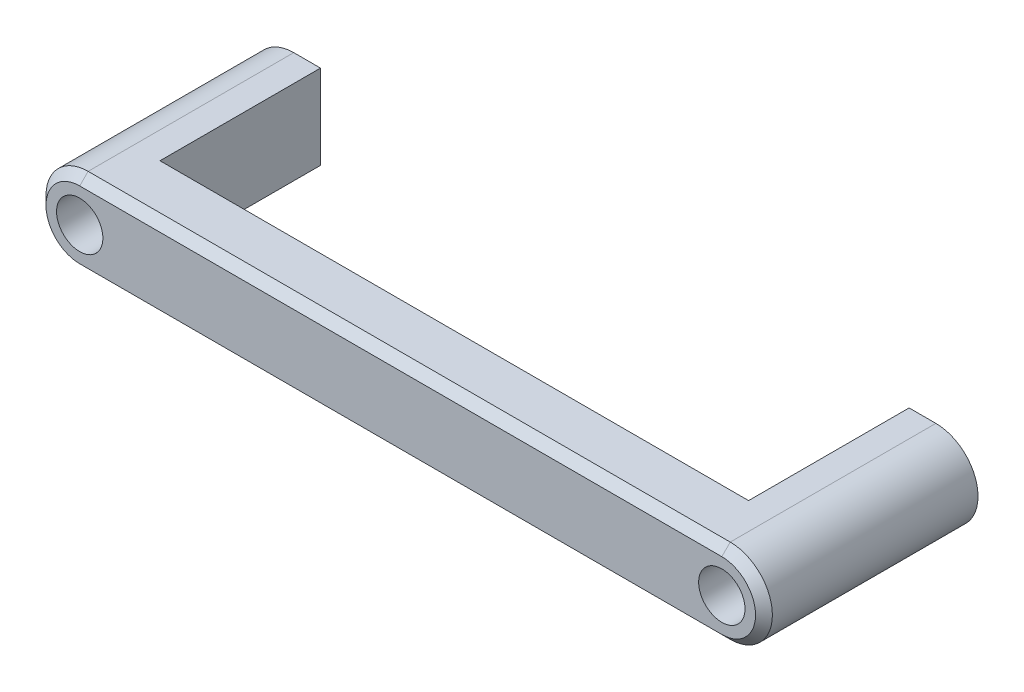
ISO-10303-21;
HEADER;
FILE_DESCRIPTION(('STEP AP214'),'2;1');
FILE_NAME('part.step','',(''),(''),'','','');
FILE_SCHEMA(('AUTOMOTIVE_DESIGN { 1 0 10303 214 1 1 1 1 }'));
ENDSEC;
DATA;
#1=APPLICATION_CONTEXT('core data for automotive mechanical design processes');
#2=APPLICATION_PROTOCOL_DEFINITION('international standard','automotive_design',2000,#1);
#3=PRODUCT_CONTEXT('',#1,'mechanical');
#4=PRODUCT('Part','Part','',(#3));
#5=PRODUCT_RELATED_PRODUCT_CATEGORY('part','',(#4));
#6=PRODUCT_DEFINITION_FORMATION('','',#4);
#7=PRODUCT_DEFINITION_CONTEXT('part definition',#1,'design');
#8=PRODUCT_DEFINITION('design','',#6,#7);
#9=PRODUCT_DEFINITION_SHAPE('','',#8);
#10=(LENGTH_UNIT() NAMED_UNIT(*) SI_UNIT(.MILLI.,.METRE.));
#11=(NAMED_UNIT(*) PLANE_ANGLE_UNIT() SI_UNIT($,.RADIAN.));
#12=(NAMED_UNIT(*) SI_UNIT($,.STERADIAN.) SOLID_ANGLE_UNIT());
#13=UNCERTAINTY_MEASURE_WITH_UNIT(LENGTH_MEASURE(1.E-05),#10,'distance_accuracy_value','');
#14=(GEOMETRIC_REPRESENTATION_CONTEXT(3) GLOBAL_UNCERTAINTY_ASSIGNED_CONTEXT((#13)) GLOBAL_UNIT_ASSIGNED_CONTEXT((#10,
#11,#12)) REPRESENTATION_CONTEXT('',''));
#15=CARTESIAN_POINT('',(0.,0.,0.));
#16=DIRECTION('',(0.,0.,1.));
#17=DIRECTION('',(1.,0.,0.));
#18=AXIS2_PLACEMENT_3D('',#15,#16,#17);
#19=CARTESIAN_POINT('',(76.2,0.,0.));
#20=DIRECTION('',(0.,0.,1.));
#21=DIRECTION('',(1.,0.,0.));
#22=AXIS2_PLACEMENT_3D('',#19,#20,#21);
#23=CYLINDRICAL_SURFACE('',#22,3.75000000000001);
#24=CARTESIAN_POINT('',(76.2,0.,13.8));
#25=DIRECTION('',(0.,0.,1.));
#26=DIRECTION('',(1.,0.,0.));
#27=AXIS2_PLACEMENT_3D('',#24,#25,#26);
#28=CIRCLE('',#27,3.75000000000001);
#29=CARTESIAN_POINT('',(79.95,0.,13.8));
#30=VERTEX_POINT('',#29);
#31=EDGE_CURVE('E232',#30,#30,#28,.T.);
#32=ORIENTED_EDGE('',*,*,#31,.T.);
#33=EDGE_LOOP('',(#32));
#34=FACE_BOUND('',#33,.T.);
#35=CARTESIAN_POINT('',(76.2,0.,0.));
#36=DIRECTION('',(0.,0.,1.));
#37=DIRECTION('',(1.,0.,0.));
#38=AXIS2_PLACEMENT_3D('',#35,#36,#37);
#39=CIRCLE('',#38,3.75000000000001);
#40=CARTESIAN_POINT('',(79.95,0.,0.));
#41=VERTEX_POINT('',#40);
#42=EDGE_CURVE('E165',#41,#41,#39,.T.);
#43=ORIENTED_EDGE('',*,*,#42,.F.);
#44=EDGE_LOOP('',(#43));
#45=FACE_BOUND('',#44,.T.);
#46=ADVANCED_FACE('F41',(#34,#45),#23,.F.);
#47=CARTESIAN_POINT('',(-76.2,0.,0.));
#48=DIRECTION('',(0.,0.,1.));
#49=DIRECTION('',(1.,0.,0.));
#50=AXIS2_PLACEMENT_3D('',#47,#48,#49);
#51=CYLINDRICAL_SURFACE('',#50,3.75000000000001);
#52=CARTESIAN_POINT('',(-76.2,0.,13.8));
#53=DIRECTION('',(0.,0.,1.));
#54=DIRECTION('',(1.,0.,0.));
#55=AXIS2_PLACEMENT_3D('',#52,#53,#54);
#56=CIRCLE('',#55,3.75000000000001);
#57=CARTESIAN_POINT('',(-72.45,0.,13.8));
#58=VERTEX_POINT('',#57);
#59=EDGE_CURVE('E251',#58,#58,#56,.T.);
#60=ORIENTED_EDGE('',*,*,#59,.T.);
#61=EDGE_LOOP('',(#60));
#62=FACE_BOUND('',#61,.T.);
#63=CARTESIAN_POINT('',(-76.2,0.,0.));
#64=DIRECTION('',(0.,0.,1.));
#65=DIRECTION('',(1.,0.,0.));
#66=AXIS2_PLACEMENT_3D('',#63,#64,#65);
#67=CIRCLE('',#66,3.75000000000001);
#68=CARTESIAN_POINT('',(-72.45,0.,0.));
#69=VERTEX_POINT('',#68);
#70=EDGE_CURVE('E166',#69,#69,#67,.T.);
#71=ORIENTED_EDGE('',*,*,#70,.F.);
#72=EDGE_LOOP('',(#71));
#73=FACE_BOUND('',#72,.T.);
#74=ADVANCED_FACE('F277',(#62,#73),#51,.F.);
#75=CARTESIAN_POINT('',(-76.2,0.,0.));
#76=DIRECTION('',(0.,0.,1.));
#77=DIRECTION('',(1.,0.,0.));
#78=AXIS2_PLACEMENT_3D('',#75,#76,#77);
#79=PLANE('',#78);
#80=ORIENTED_EDGE('',*,*,#70,.T.);
#81=EDGE_LOOP('',(#80));
#82=FACE_BOUND('',#81,.T.);
#83=DIRECTION('',(-1.,0.,0.));
#84=VECTOR('',#83,1.);
#85=CARTESIAN_POINT('',(-76.2,10.,0.));
#86=LINE('',#85,#84);
#87=CARTESIAN_POINT('',(-69.85,10.,0.));
#88=VERTEX_POINT('',#87);
#89=CARTESIAN_POINT('',(-76.2,10.,0.));
#90=VERTEX_POINT('',#89);
#91=EDGE_CURVE('E186',#88,#90,#86,.T.);
#92=ORIENTED_EDGE('',*,*,#91,.F.);
#93=DIRECTION('',(0.,-1.,0.));
#94=VECTOR('',#93,1.);
#95=CARTESIAN_POINT('',(-69.85,0.,0.));
#96=LINE('',#95,#94);
#97=CARTESIAN_POINT('',(-69.85,-10.,0.));
#98=VERTEX_POINT('',#97);
#99=EDGE_CURVE('E140',#88,#98,#96,.T.);
#100=ORIENTED_EDGE('',*,*,#99,.T.);
#101=DIRECTION('',(1.,0.,0.));
#102=VECTOR('',#101,1.);
#103=CARTESIAN_POINT('',(-76.2,-10.,0.));
#104=LINE('',#103,#102);
#105=CARTESIAN_POINT('',(-76.2,-10.,0.));
#106=VERTEX_POINT('',#105);
#107=EDGE_CURVE('E178',#106,#98,#104,.T.);
#108=ORIENTED_EDGE('',*,*,#107,.F.);
#109=CARTESIAN_POINT('',(-76.2,0.,0.));
#110=DIRECTION('',(0.,0.,1.));
#111=DIRECTION('',(1.,0.,0.));
#112=AXIS2_PLACEMENT_3D('',#109,#110,#111);
#113=CIRCLE('',#112,10.);
#114=EDGE_CURVE('E170',#90,#106,#113,.T.);
#115=ORIENTED_EDGE('',*,*,#114,.F.);
#116=EDGE_LOOP('',(#92,#100,#108,#115));
#117=FACE_BOUND('',#116,.T.);
#118=ADVANCED_FACE('F283',(#82,#117),#79,.F.);
#119=CARTESIAN_POINT('',(-76.2,0.,50.8));
#120=DIRECTION('',(0.,0.,-1.));
#121=DIRECTION('',(-1.,0.,0.));
#122=AXIS2_PLACEMENT_3D('',#119,#120,#121);
#123=CYLINDRICAL_SURFACE('',#122,10.);
#124=DIRECTION('',(0.,0.,-1.));
#125=VECTOR('',#124,1.);
#126=CARTESIAN_POINT('',(-76.2,-10.,50.8));
#127=LINE('',#126,#125);
#128=CARTESIAN_POINT('',(-76.2,-10.,48.8));
#129=VERTEX_POINT('',#128);
#130=EDGE_CURVE('E199',#129,#106,#127,.T.);
#131=ORIENTED_EDGE('',*,*,#130,.F.);
#132=CARTESIAN_POINT('',(-76.2,0.,48.8));
#133=DIRECTION('',(0.,0.,1.));
#134=DIRECTION('',(1.,0.,0.));
#135=AXIS2_PLACEMENT_3D('',#132,#133,#134);
#136=CIRCLE('',#135,10.);
#137=CARTESIAN_POINT('',(-76.2,10.,48.8));
#138=VERTEX_POINT('',#137);
#139=EDGE_CURVE('E58',#129,#138,#136,.F.);
#140=ORIENTED_EDGE('',*,*,#139,.T.);
#141=DIRECTION('',(0.,0.,-1.));
#142=VECTOR('',#141,1.);
#143=CARTESIAN_POINT('',(-76.2,10.,50.8));
#144=LINE('',#143,#142);
#145=EDGE_CURVE('E190',#138,#90,#144,.T.);
#146=ORIENTED_EDGE('',*,*,#145,.T.);
#147=ORIENTED_EDGE('',*,*,#114,.T.);
#148=EDGE_LOOP('',(#131,#140,#146,#147));
#149=FACE_BOUND('',#148,.T.);
#150=ADVANCED_FACE('F306',(#149),#123,.T.);
#151=CARTESIAN_POINT('',(-76.2,-10.,50.8));
#152=DIRECTION('',(0.,1.,0.));
#153=DIRECTION('',(-1.,0.,0.));
#154=AXIS2_PLACEMENT_3D('',#151,#152,#153);
#155=PLANE('',#154);
#156=DIRECTION('',(0.,0.,-1.));
#157=VECTOR('',#156,1.);
#158=CARTESIAN_POINT('',(76.2,-10.,50.8));
#159=LINE('',#158,#157);
#160=CARTESIAN_POINT('',(76.2,-10.,48.8));
#161=VERTEX_POINT('',#160);
#162=CARTESIAN_POINT('',(76.2,-10.,0.));
#163=VERTEX_POINT('',#162);
#164=EDGE_CURVE('E196',#161,#163,#159,.T.);
#165=ORIENTED_EDGE('',*,*,#164,.F.);
#166=DIRECTION('',(-1.,0.,0.));
#167=VECTOR('',#166,1.);
#168=CARTESIAN_POINT('',(-76.2,-10.,48.8));
#169=LINE('',#168,#167);
#170=EDGE_CURVE('E221',#161,#129,#169,.T.);
#171=ORIENTED_EDGE('',*,*,#170,.T.);
#172=ORIENTED_EDGE('',*,*,#130,.T.);
#173=ORIENTED_EDGE('',*,*,#107,.T.);
#174=DIRECTION('',(0.,0.,1.));
#175=VECTOR('',#174,1.);
#176=CARTESIAN_POINT('',(-69.85,-10.,50.8));
#177=LINE('',#176,#175);
#178=CARTESIAN_POINT('',(-69.85,-9.99999999999999,38.1));
#179=VERTEX_POINT('',#178);
#180=EDGE_CURVE('E160',#98,#179,#177,.T.);
#181=ORIENTED_EDGE('',*,*,#180,.T.);
#182=DIRECTION('',(1.,0.,0.));
#183=VECTOR('',#182,1.);
#184=CARTESIAN_POINT('',(-76.2,-10.,38.1));
#185=LINE('',#184,#183);
#186=CARTESIAN_POINT('',(69.85,-9.99999999999999,38.1));
#187=VERTEX_POINT('',#186);
#188=EDGE_CURVE('E129',#179,#187,#185,.T.);
#189=ORIENTED_EDGE('',*,*,#188,.T.);
#190=DIRECTION('',(0.,0.,-1.));
#191=VECTOR('',#190,1.);
#192=CARTESIAN_POINT('',(69.85,-9.99999999999997,50.8));
#193=LINE('',#192,#191);
#194=CARTESIAN_POINT('',(69.85,-10.,0.));
#195=VERTEX_POINT('',#194);
#196=EDGE_CURVE('E155',#187,#195,#193,.T.);
#197=ORIENTED_EDGE('',*,*,#196,.T.);
#198=EDGE_CURVE('E177',#195,#163,#104,.T.);
#199=ORIENTED_EDGE('',*,*,#198,.T.);
#200=EDGE_LOOP('',(#165,#171,#172,#173,#181,#189,#197,#199));
#201=FACE_BOUND('',#200,.T.);
#202=ADVANCED_FACE('F302',(#201),#155,.F.);
#203=CARTESIAN_POINT('',(76.2,0.,50.8));
#204=DIRECTION('',(0.,0.,-1.));
#205=DIRECTION('',(-1.,0.,0.));
#206=AXIS2_PLACEMENT_3D('',#203,#204,#205);
#207=CYLINDRICAL_SURFACE('',#206,10.);
#208=DIRECTION('',(0.,0.,-1.));
#209=VECTOR('',#208,1.);
#210=CARTESIAN_POINT('',(76.2,10.,50.8));
#211=LINE('',#210,#209);
#212=CARTESIAN_POINT('',(76.2,10.,48.8));
#213=VERTEX_POINT('',#212);
#214=CARTESIAN_POINT('',(76.2,10.,0.));
#215=VERTEX_POINT('',#214);
#216=EDGE_CURVE('E193',#213,#215,#211,.T.);
#217=ORIENTED_EDGE('',*,*,#216,.F.);
#218=CARTESIAN_POINT('',(76.2,0.,48.8));
#219=DIRECTION('',(0.,0.,1.));
#220=DIRECTION('',(1.,0.,0.));
#221=AXIS2_PLACEMENT_3D('',#218,#219,#220);
#222=CIRCLE('',#221,10.);
#223=EDGE_CURVE('E225',#213,#161,#222,.F.);
#224=ORIENTED_EDGE('',*,*,#223,.T.);
#225=ORIENTED_EDGE('',*,*,#164,.T.);
#226=CARTESIAN_POINT('',(76.2,0.,0.));
#227=DIRECTION('',(0.,0.,1.));
#228=DIRECTION('',(1.,0.,0.));
#229=AXIS2_PLACEMENT_3D('',#226,#227,#228);
#230=CIRCLE('',#229,10.);
#231=EDGE_CURVE('E182',#163,#215,#230,.T.);
#232=ORIENTED_EDGE('',*,*,#231,.T.);
#233=EDGE_LOOP('',(#217,#224,#225,#232));
#234=FACE_BOUND('',#233,.T.);
#235=ADVANCED_FACE('F299',(#234),#207,.T.);
#236=CARTESIAN_POINT('',(-76.2,10.,50.8));
#237=DIRECTION('',(0.,-1.,0.));
#238=DIRECTION('',(1.,0.,0.));
#239=AXIS2_PLACEMENT_3D('',#236,#237,#238);
#240=PLANE('',#239);
#241=ORIENTED_EDGE('',*,*,#145,.F.);
#242=DIRECTION('',(1.,0.,0.));
#243=VECTOR('',#242,1.);
#244=CARTESIAN_POINT('',(76.2,10.,48.8));
#245=LINE('',#244,#243);
#246=EDGE_CURVE('E65',#138,#213,#245,.T.);
#247=ORIENTED_EDGE('',*,*,#246,.T.);
#248=ORIENTED_EDGE('',*,*,#216,.T.);
#249=CARTESIAN_POINT('',(69.8499999999999,10.,0.));
#250=VERTEX_POINT('',#249);
#251=EDGE_CURVE('E187',#215,#250,#86,.T.);
#252=ORIENTED_EDGE('',*,*,#251,.T.);
#253=DIRECTION('',(0.,0.,-1.));
#254=VECTOR('',#253,1.);
#255=CARTESIAN_POINT('',(69.85,10.,0.));
#256=LINE('',#255,#254);
#257=CARTESIAN_POINT('',(69.85,10.,38.1));
#258=VERTEX_POINT('',#257);
#259=EDGE_CURVE('E134',#258,#250,#256,.T.);
#260=ORIENTED_EDGE('',*,*,#259,.F.);
#261=DIRECTION('',(1.,0.,0.));
#262=VECTOR('',#261,1.);
#263=CARTESIAN_POINT('',(-69.85,10.,38.1));
#264=LINE('',#263,#262);
#265=CARTESIAN_POINT('',(-69.85,10.,38.1));
#266=VERTEX_POINT('',#265);
#267=EDGE_CURVE('E126',#266,#258,#264,.T.);
#268=ORIENTED_EDGE('',*,*,#267,.F.);
#269=DIRECTION('',(0.,0.,1.));
#270=VECTOR('',#269,1.);
#271=CARTESIAN_POINT('',(-69.85,10.,0.));
#272=LINE('',#271,#270);
#273=EDGE_CURVE('E137',#88,#266,#272,.T.);
#274=ORIENTED_EDGE('',*,*,#273,.F.);
#275=ORIENTED_EDGE('',*,*,#91,.T.);
#276=EDGE_LOOP('',(#241,#247,#248,#252,#260,#268,#274,#275));
#277=FACE_BOUND('',#276,.T.);
#278=ADVANCED_FACE('F146',(#277),#240,.F.);
#279=CARTESIAN_POINT('',(-76.2,0.,50.8));
#280=DIRECTION('',(0.,0.,1.));
#281=DIRECTION('',(1.,0.,0.));
#282=AXIS2_PLACEMENT_3D('',#279,#280,#281);
#283=PLANE('',#282);
#284=CARTESIAN_POINT('',(-76.2,0.,50.8));
#285=DIRECTION('',(0.,0.,1.));
#286=DIRECTION('',(1.,0.,0.));
#287=AXIS2_PLACEMENT_3D('',#284,#285,#286);
#288=CIRCLE('',#287,8.);
#289=CARTESIAN_POINT('',(-76.2,8.,50.8));
#290=VERTEX_POINT('',#289);
#291=CARTESIAN_POINT('',(-76.2,-8.,50.8));
#292=VERTEX_POINT('',#291);
#293=EDGE_CURVE('E211',#290,#292,#288,.T.);
#294=ORIENTED_EDGE('',*,*,#293,.T.);
#295=DIRECTION('',(1.,0.,0.));
#296=VECTOR('',#295,1.);
#297=CARTESIAN_POINT('',(76.2,-7.99999999999997,50.8));
#298=LINE('',#297,#296);
#299=CARTESIAN_POINT('',(76.2,-8.,50.8));
#300=VERTEX_POINT('',#299);
#301=EDGE_CURVE('E217',#292,#300,#298,.T.);
#302=ORIENTED_EDGE('',*,*,#301,.T.);
#303=CARTESIAN_POINT('',(76.2,0.,50.8));
#304=DIRECTION('',(0.,0.,1.));
#305=DIRECTION('',(1.,0.,0.));
#306=AXIS2_PLACEMENT_3D('',#303,#304,#305);
#307=CIRCLE('',#306,8.);
#308=CARTESIAN_POINT('',(76.2,8.00000000000003,50.8));
#309=VERTEX_POINT('',#308);
#310=EDGE_CURVE('E214',#300,#309,#307,.T.);
#311=ORIENTED_EDGE('',*,*,#310,.T.);
#312=DIRECTION('',(-1.,0.,0.));
#313=VECTOR('',#312,1.);
#314=CARTESIAN_POINT('',(-76.2,8.,50.8));
#315=LINE('',#314,#313);
#316=EDGE_CURVE('E208',#309,#290,#315,.T.);
#317=ORIENTED_EDGE('',*,*,#316,.T.);
#318=EDGE_LOOP('',(#294,#302,#311,#317));
#319=FACE_BOUND('',#318,.T.);
#320=CARTESIAN_POINT('',(-76.2,0.,50.8));
#321=DIRECTION('',(0.,0.,1.));
#322=DIRECTION('',(1.,0.,0.));
#323=AXIS2_PLACEMENT_3D('',#320,#321,#322);
#324=CIRCLE('',#323,5.5);
#325=CARTESIAN_POINT('',(-70.7,0.,50.8));
#326=VERTEX_POINT('',#325);
#327=EDGE_CURVE('E144',#326,#326,#324,.T.);
#328=ORIENTED_EDGE('',*,*,#327,.F.);
#329=EDGE_LOOP('',(#328));
#330=FACE_BOUND('',#329,.T.);
#331=CARTESIAN_POINT('',(76.2,0.,50.8));
#332=DIRECTION('',(0.,0.,1.));
#333=DIRECTION('',(1.,0.,0.));
#334=AXIS2_PLACEMENT_3D('',#331,#332,#333);
#335=CIRCLE('',#334,5.5);
#336=CARTESIAN_POINT('',(81.7,0.,50.8));
#337=VERTEX_POINT('',#336);
#338=EDGE_CURVE('E247',#337,#337,#335,.T.);
#339=ORIENTED_EDGE('',*,*,#338,.F.);
#340=EDGE_LOOP('',(#339));
#341=FACE_BOUND('',#340,.T.);
#342=ADVANCED_FACE('F289',(#319,#330,#341),#283,.T.);
#343=ORIENTED_EDGE('',*,*,#42,.T.);
#344=EDGE_LOOP('',(#343));
#345=FACE_BOUND('',#344,.T.);
#346=ORIENTED_EDGE('',*,*,#198,.F.);
#347=DIRECTION('',(0.,1.,0.));
#348=VECTOR('',#347,1.);
#349=CARTESIAN_POINT('',(69.85,0.,0.));
#350=LINE('',#349,#348);
#351=EDGE_CURVE('E202',#195,#250,#350,.T.);
#352=ORIENTED_EDGE('',*,*,#351,.T.);
#353=ORIENTED_EDGE('',*,*,#251,.F.);
#354=ORIENTED_EDGE('',*,*,#231,.F.);
#355=EDGE_LOOP('',(#346,#352,#353,#354));
#356=FACE_BOUND('',#355,.T.);
#357=ADVANCED_FACE('F292',(#345,#356),#79,.F.);
#358=CARTESIAN_POINT('',(-69.85,-40.8,38.1));
#359=DIRECTION('',(0.,0.,1.));
#360=DIRECTION('',(1.,0.,0.));
#361=AXIS2_PLACEMENT_3D('',#358,#359,#360);
#362=PLANE('',#361);
#363=DIRECTION('',(0.,1.,0.));
#364=VECTOR('',#363,1.);
#365=CARTESIAN_POINT('',(-69.85,-40.8,38.1));
#366=LINE('',#365,#364);
#367=EDGE_CURVE('E121',#179,#266,#366,.T.);
#368=ORIENTED_EDGE('',*,*,#367,.T.);
#369=ORIENTED_EDGE('',*,*,#267,.T.);
#370=DIRECTION('',(0.,1.,0.));
#371=VECTOR('',#370,1.);
#372=CARTESIAN_POINT('',(69.85,-40.8,38.1));
#373=LINE('',#372,#371);
#374=EDGE_CURVE('E133',#187,#258,#373,.T.);
#375=ORIENTED_EDGE('',*,*,#374,.F.);
#376=ORIENTED_EDGE('',*,*,#188,.F.);
#377=EDGE_LOOP('',(#368,#369,#375,#376));
#378=FACE_BOUND('',#377,.T.);
#379=ADVANCED_FACE('F123',(#378),#362,.F.);
#380=CARTESIAN_POINT('',(-69.85,-40.8,0.));
#381=DIRECTION('',(-1.,0.,0.));
#382=DIRECTION('',(0.,-1.,0.));
#383=AXIS2_PLACEMENT_3D('',#380,#381,#382);
#384=PLANE('',#383);
#385=ORIENTED_EDGE('',*,*,#99,.F.);
#386=ORIENTED_EDGE('',*,*,#273,.T.);
#387=ORIENTED_EDGE('',*,*,#367,.F.);
#388=ORIENTED_EDGE('',*,*,#180,.F.);
#389=EDGE_LOOP('',(#385,#386,#387,#388));
#390=FACE_BOUND('',#389,.T.);
#391=ADVANCED_FACE('F138',(#390),#384,.F.);
#392=CARTESIAN_POINT('',(69.85,-40.8,0.));
#393=DIRECTION('',(1.,0.,0.));
#394=DIRECTION('',(0.,1.,0.));
#395=AXIS2_PLACEMENT_3D('',#392,#393,#394);
#396=PLANE('',#395);
#397=ORIENTED_EDGE('',*,*,#374,.T.);
#398=ORIENTED_EDGE('',*,*,#259,.T.);
#399=ORIENTED_EDGE('',*,*,#351,.F.);
#400=ORIENTED_EDGE('',*,*,#196,.F.);
#401=EDGE_LOOP('',(#397,#398,#399,#400));
#402=FACE_BOUND('',#401,.T.);
#403=ADVANCED_FACE('F361',(#402),#396,.F.);
#404=CARTESIAN_POINT('',(-76.2,0.,15.8));
#405=DIRECTION('',(0.,0.,1.));
#406=DIRECTION('',(1.,0.,0.));
#407=AXIS2_PLACEMENT_3D('',#404,#405,#406);
#408=CYLINDRICAL_SURFACE('',#407,5.5);
#409=CARTESIAN_POINT('',(-76.2,0.,15.55));
#410=DIRECTION('',(0.,0.,1.));
#411=DIRECTION('',(1.,0.,0.));
#412=AXIS2_PLACEMENT_3D('',#409,#410,#411);
#413=CIRCLE('',#412,5.5);
#414=CARTESIAN_POINT('',(-70.7,0.,15.55));
#415=VERTEX_POINT('',#414);
#416=EDGE_CURVE('E11',#415,#415,#413,.F.);
#417=ORIENTED_EDGE('',*,*,#416,.T.);
#418=EDGE_LOOP('',(#417));
#419=FACE_BOUND('',#418,.T.);
#420=ORIENTED_EDGE('',*,*,#327,.T.);
#421=EDGE_LOOP('',(#420));
#422=FACE_BOUND('',#421,.T.);
#423=ADVANCED_FACE('F334',(#419,#422),#408,.F.);
#424=CARTESIAN_POINT('',(76.2,0.,15.8));
#425=DIRECTION('',(0.,0.,1.));
#426=DIRECTION('',(1.,0.,0.));
#427=AXIS2_PLACEMENT_3D('',#424,#425,#426);
#428=CYLINDRICAL_SURFACE('',#427,5.5);
#429=CARTESIAN_POINT('',(76.2,0.,15.55));
#430=DIRECTION('',(0.,0.,1.));
#431=DIRECTION('',(1.,0.,0.));
#432=AXIS2_PLACEMENT_3D('',#429,#430,#431);
#433=CIRCLE('',#432,5.5);
#434=CARTESIAN_POINT('',(81.7,0.,15.55));
#435=VERTEX_POINT('',#434);
#436=EDGE_CURVE('E51',#435,#435,#433,.F.);
#437=ORIENTED_EDGE('',*,*,#436,.T.);
#438=EDGE_LOOP('',(#437));
#439=FACE_BOUND('',#438,.T.);
#440=ORIENTED_EDGE('',*,*,#338,.T.);
#441=EDGE_LOOP('',(#440));
#442=FACE_BOUND('',#441,.T.);
#443=ADVANCED_FACE('F258',(#439,#442),#428,.F.);
#444=CARTESIAN_POINT('',(-76.2,8.,50.8));
#445=DIRECTION('',(0.,0.707106781186547,0.707106781186547));
#446=DIRECTION('',(1.,0.,0.));
#447=AXIS2_PLACEMENT_3D('',#444,#445,#446);
#448=PLANE('',#447);
#449=DIRECTION('',(0.,-0.707106781186547,0.707106781186547));
#450=VECTOR('',#449,1.);
#451=CARTESIAN_POINT('',(76.2,10.,48.8));
#452=LINE('',#451,#450);
#453=EDGE_CURVE('E239',#213,#309,#452,.T.);
#454=ORIENTED_EDGE('',*,*,#453,.F.);
#455=ORIENTED_EDGE('',*,*,#246,.F.);
#456=DIRECTION('',(0.,0.707106781186547,-0.707106781186547));
#457=VECTOR('',#456,1.);
#458=CARTESIAN_POINT('',(-76.2,8.,50.8));
#459=LINE('',#458,#457);
#460=EDGE_CURVE('E243',#290,#138,#459,.T.);
#461=ORIENTED_EDGE('',*,*,#460,.F.);
#462=ORIENTED_EDGE('',*,*,#316,.F.);
#463=EDGE_LOOP('',(#454,#455,#461,#462));
#464=FACE_BOUND('',#463,.T.);
#465=ADVANCED_FACE('F325',(#464),#448,.T.);
#466=CARTESIAN_POINT('',(-76.2,0.,50.8));
#467=DIRECTION('',(0.,0.,-1.));
#468=DIRECTION('',(-1.,0.,0.));
#469=AXIS2_PLACEMENT_3D('',#466,#467,#468);
#470=CONICAL_SURFACE('',#469,8.,0.785398163397448);
#471=ORIENTED_EDGE('',*,*,#460,.T.);
#472=ORIENTED_EDGE('',*,*,#139,.F.);
#473=DIRECTION('',(0.,-0.707106781186547,-0.707106781186547));
#474=VECTOR('',#473,1.);
#475=CARTESIAN_POINT('',(-76.2,-8.,50.8));
#476=LINE('',#475,#474);
#477=EDGE_CURVE('E236',#292,#129,#476,.T.);
#478=ORIENTED_EDGE('',*,*,#477,.F.);
#479=ORIENTED_EDGE('',*,*,#293,.F.);
#480=EDGE_LOOP('',(#471,#472,#478,#479));
#481=FACE_BOUND('',#480,.T.);
#482=ADVANCED_FACE('F319',(#481),#470,.T.);
#483=CARTESIAN_POINT('',(76.2,0.,50.8));
#484=DIRECTION('',(0.,0.,-1.));
#485=DIRECTION('',(-1.,0.,0.));
#486=AXIS2_PLACEMENT_3D('',#483,#484,#485);
#487=CONICAL_SURFACE('',#486,8.,0.785398163397448);
#488=ORIENTED_EDGE('',*,*,#453,.T.);
#489=ORIENTED_EDGE('',*,*,#310,.F.);
#490=DIRECTION('',(0.,0.707106781186547,0.707106781186547));
#491=VECTOR('',#490,1.);
#492=CARTESIAN_POINT('',(76.2,-10.,48.8));
#493=LINE('',#492,#491);
#494=EDGE_CURVE('E233',#161,#300,#493,.T.);
#495=ORIENTED_EDGE('',*,*,#494,.F.);
#496=ORIENTED_EDGE('',*,*,#223,.F.);
#497=EDGE_LOOP('',(#488,#489,#495,#496));
#498=FACE_BOUND('',#497,.T.);
#499=ADVANCED_FACE('F270',(#498),#487,.T.);
#500=CARTESIAN_POINT('',(-76.2,-8.,50.8));
#501=DIRECTION('',(0.,-0.707106781186547,0.707106781186547));
#502=DIRECTION('',(-1.,0.,0.));
#503=AXIS2_PLACEMENT_3D('',#500,#501,#502);
#504=PLANE('',#503);
#505=ORIENTED_EDGE('',*,*,#477,.T.);
#506=ORIENTED_EDGE('',*,*,#170,.F.);
#507=ORIENTED_EDGE('',*,*,#494,.T.);
#508=ORIENTED_EDGE('',*,*,#301,.F.);
#509=EDGE_LOOP('',(#505,#506,#507,#508));
#510=FACE_BOUND('',#509,.T.);
#511=ADVANCED_FACE('F263',(#510),#504,.T.);
#512=CARTESIAN_POINT('',(76.2,0.,15.8));
#513=DIRECTION('',(0.,0.,1.));
#514=DIRECTION('',(1.,0.,0.));
#515=AXIS2_PLACEMENT_3D('',#512,#513,#514);
#516=CONICAL_SURFACE('',#515,5.75000000000005,0.785398163397455);
#517=ORIENTED_EDGE('',*,*,#31,.F.);
#518=EDGE_LOOP('',(#517));
#519=FACE_BOUND('',#518,.T.);
#520=ORIENTED_EDGE('',*,*,#436,.F.);
#521=EDGE_LOOP('',(#520));
#522=FACE_BOUND('',#521,.T.);
#523=ADVANCED_FACE('F261',(#519,#522),#516,.F.);
#524=CARTESIAN_POINT('',(-76.2,0.,15.8));
#525=DIRECTION('',(0.,0.,1.));
#526=DIRECTION('',(1.,0.,0.));
#527=AXIS2_PLACEMENT_3D('',#524,#525,#526);
#528=CONICAL_SURFACE('',#527,5.75000000000005,0.785398163397455);
#529=ORIENTED_EDGE('',*,*,#59,.F.);
#530=EDGE_LOOP('',(#529));
#531=FACE_BOUND('',#530,.T.);
#532=ORIENTED_EDGE('',*,*,#416,.F.);
#533=EDGE_LOOP('',(#532));
#534=FACE_BOUND('',#533,.T.);
#535=ADVANCED_FACE('F44',(#531,#534),#528,.F.);
#536=CLOSED_SHELL('',(#46,#74,#118,#150,#202,#235,#278,#342,#357,#379,#391,#403,#423,#443,#465,
#482,#499,#511,#523,#535));
#537=MANIFOLD_SOLID_BREP('B2',#536);
#538=ADVANCED_BREP_SHAPE_REPRESENTATION('',(#18,#537),#14);
#539=SHAPE_DEFINITION_REPRESENTATION(#9,#538);
ENDSEC;
END-ISO-10303-21;
